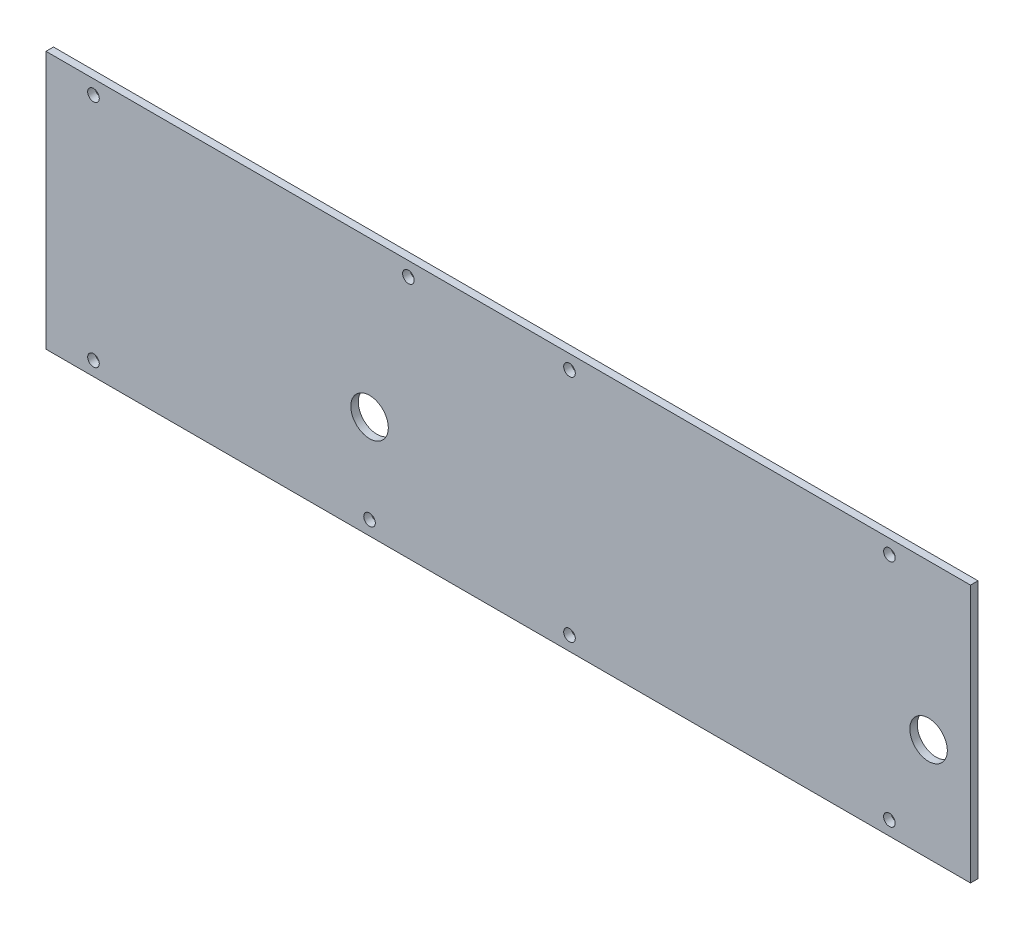
ISO-10303-21;
HEADER;
FILE_DESCRIPTION(('STEP AP214'),'2;1');
FILE_NAME('part.step','',(''),(''),'','','');
FILE_SCHEMA(('AUTOMOTIVE_DESIGN { 1 0 10303 214 1 1 1 1 }'));
ENDSEC;
DATA;
#1=APPLICATION_CONTEXT('core data for automotive mechanical design processes');
#2=APPLICATION_PROTOCOL_DEFINITION('international standard','automotive_design',2000,#1);
#3=PRODUCT_CONTEXT('',#1,'mechanical');
#4=PRODUCT('Part','Part','',(#3));
#5=PRODUCT_RELATED_PRODUCT_CATEGORY('part','',(#4));
#6=PRODUCT_DEFINITION_FORMATION('','',#4);
#7=PRODUCT_DEFINITION_CONTEXT('part definition',#1,'design');
#8=PRODUCT_DEFINITION('design','',#6,#7);
#9=PRODUCT_DEFINITION_SHAPE('','',#8);
#10=(LENGTH_UNIT() NAMED_UNIT(*) SI_UNIT(.MILLI.,.METRE.));
#11=(NAMED_UNIT(*) PLANE_ANGLE_UNIT() SI_UNIT($,.RADIAN.));
#12=(NAMED_UNIT(*) SI_UNIT($,.STERADIAN.) SOLID_ANGLE_UNIT());
#13=UNCERTAINTY_MEASURE_WITH_UNIT(LENGTH_MEASURE(1.E-05),#10,'distance_accuracy_value','');
#14=(GEOMETRIC_REPRESENTATION_CONTEXT(3) GLOBAL_UNCERTAINTY_ASSIGNED_CONTEXT((#13)) GLOBAL_UNIT_ASSIGNED_CONTEXT((#10,
#11,#12)) REPRESENTATION_CONTEXT('',''));
#15=CARTESIAN_POINT('',(0.,0.,0.));
#16=DIRECTION('',(0.,0.,1.));
#17=DIRECTION('',(1.,0.,0.));
#18=AXIS2_PLACEMENT_3D('',#15,#16,#17);
#19=CARTESIAN_POINT('',(0.,0.,-1.1049));
#20=DIRECTION('',(0.,0.,1.));
#21=DIRECTION('',(1.,0.,0.));
#22=AXIS2_PLACEMENT_3D('',#19,#20,#21);
#23=PLANE('',#22);
#24=CARTESIAN_POINT('',(112.5728,-33.9217,-1.1049));
#25=DIRECTION('',(0.,0.,-1.));
#26=DIRECTION('',(-1.,0.,0.));
#27=AXIS2_PLACEMENT_3D('',#24,#25,#26);
#28=CIRCLE('',#27,1.71449999999998);
#29=CARTESIAN_POINT('',(110.8583,-33.9217,-1.1049));
#30=VERTEX_POINT('',#29);
#31=EDGE_CURVE('E109',#30,#30,#28,.F.);
#32=ORIENTED_EDGE('',*,*,#31,.T.);
#33=EDGE_LOOP('',(#32));
#34=FACE_BOUND('',#33,.T.);
#35=CARTESIAN_POINT('',(-40.9702,-33.9217,-1.1049));
#36=DIRECTION('',(0.,0.,-1.));
#37=DIRECTION('',(-1.,0.,0.));
#38=AXIS2_PLACEMENT_3D('',#35,#36,#37);
#39=CIRCLE('',#38,1.71450000000002);
#40=CARTESIAN_POINT('',(-42.6847,-33.9217,-1.1049));
#41=VERTEX_POINT('',#40);
#42=EDGE_CURVE('E113',#41,#41,#39,.F.);
#43=ORIENTED_EDGE('',*,*,#42,.T.);
#44=EDGE_LOOP('',(#43));
#45=FACE_BOUND('',#44,.T.);
#46=CARTESIAN_POINT('',(18.0848,33.9217,-1.1049));
#47=DIRECTION('',(0.,0.,-1.));
#48=DIRECTION('',(-1.,0.,0.));
#49=AXIS2_PLACEMENT_3D('',#46,#47,#48);
#50=CIRCLE('',#49,1.71450000000001);
#51=CARTESIAN_POINT('',(16.3703,33.9217,-1.1049));
#52=VERTEX_POINT('',#51);
#53=EDGE_CURVE('E116',#52,#52,#50,.F.);
#54=ORIENTED_EDGE('',*,*,#53,.T.);
#55=EDGE_LOOP('',(#54));
#56=FACE_BOUND('',#55,.T.);
#57=CARTESIAN_POINT('',(-122.5042,-33.9217,-1.1049));
#58=DIRECTION('',(0.,0.,-1.));
#59=DIRECTION('',(-1.,0.,0.));
#60=AXIS2_PLACEMENT_3D('',#57,#58,#59);
#61=CIRCLE('',#60,1.7145);
#62=CARTESIAN_POINT('',(-124.2187,-33.9217,-1.1049));
#63=VERTEX_POINT('',#62);
#64=EDGE_CURVE('E119',#63,#63,#61,.F.);
#65=ORIENTED_EDGE('',*,*,#64,.T.);
#66=EDGE_LOOP('',(#65));
#67=FACE_BOUND('',#66,.T.);
#68=CARTESIAN_POINT('',(-122.5042,33.9217,-1.1049));
#69=DIRECTION('',(0.,0.,-1.));
#70=DIRECTION('',(-1.,0.,0.));
#71=AXIS2_PLACEMENT_3D('',#68,#69,#70);
#72=CIRCLE('',#71,1.71449999999998);
#73=CARTESIAN_POINT('',(-124.2187,33.9217,-1.1049));
#74=VERTEX_POINT('',#73);
#75=EDGE_CURVE('E122',#74,#74,#72,.F.);
#76=ORIENTED_EDGE('',*,*,#75,.T.);
#77=EDGE_LOOP('',(#76));
#78=FACE_BOUND('',#77,.T.);
#79=CARTESIAN_POINT('',(-29.4894,33.9217,-1.1049));
#80=DIRECTION('',(0.,0.,-1.));
#81=DIRECTION('',(-1.,0.,0.));
#82=AXIS2_PLACEMENT_3D('',#79,#80,#81);
#83=CIRCLE('',#82,1.71449999999999);
#84=CARTESIAN_POINT('',(-31.2039,33.9217,-1.1049));
#85=VERTEX_POINT('',#84);
#86=EDGE_CURVE('E125',#85,#85,#83,.F.);
#87=ORIENTED_EDGE('',*,*,#86,.T.);
#88=EDGE_LOOP('',(#87));
#89=FACE_BOUND('',#88,.T.);
#90=CARTESIAN_POINT('',(112.5728,33.9217,-1.1049));
#91=DIRECTION('',(0.,0.,-1.));
#92=DIRECTION('',(-1.,0.,0.));
#93=AXIS2_PLACEMENT_3D('',#90,#91,#92);
#94=CIRCLE('',#93,1.71449999999997);
#95=CARTESIAN_POINT('',(110.8583,33.9217,-1.1049));
#96=VERTEX_POINT('',#95);
#97=EDGE_CURVE('E128',#96,#96,#94,.F.);
#98=ORIENTED_EDGE('',*,*,#97,.T.);
#99=EDGE_LOOP('',(#98));
#100=FACE_BOUND('',#99,.T.);
#101=CARTESIAN_POINT('',(18.0848,-33.9217,-1.1049));
#102=DIRECTION('',(0.,0.,-1.));
#103=DIRECTION('',(-1.,0.,0.));
#104=AXIS2_PLACEMENT_3D('',#101,#102,#103);
#105=CIRCLE('',#104,1.71450000000003);
#106=CARTESIAN_POINT('',(16.3703,-33.9217,-1.1049));
#107=VERTEX_POINT('',#106);
#108=EDGE_CURVE('E131',#107,#107,#105,.F.);
#109=ORIENTED_EDGE('',*,*,#108,.T.);
#110=EDGE_LOOP('',(#109));
#111=FACE_BOUND('',#110,.T.);
#112=CARTESIAN_POINT('',(124.1298,-7.6581,-1.1049));
#113=DIRECTION('',(0.,0.,-1.));
#114=DIRECTION('',(-1.,0.,0.));
#115=AXIS2_PLACEMENT_3D('',#112,#113,#114);
#116=CIRCLE('',#115,5.5372);
#117=CARTESIAN_POINT('',(118.5926,-7.6581,-1.1049));
#118=VERTEX_POINT('',#117);
#119=EDGE_CURVE('E133',#118,#118,#116,.F.);
#120=ORIENTED_EDGE('',*,*,#119,.T.);
#121=EDGE_LOOP('',(#120));
#122=FACE_BOUND('',#121,.T.);
#123=CARTESIAN_POINT('',(-40.9702,-7.65809999999999,-1.1049));
#124=DIRECTION('',(0.,0.,-1.));
#125=DIRECTION('',(-1.,0.,0.));
#126=AXIS2_PLACEMENT_3D('',#123,#124,#125);
#127=CIRCLE('',#126,5.5372);
#128=CARTESIAN_POINT('',(-46.5074,-7.65809999999999,-1.1049));
#129=VERTEX_POINT('',#128);
#130=EDGE_CURVE('E21',#129,#129,#127,.F.);
#131=ORIENTED_EDGE('',*,*,#130,.T.);
#132=EDGE_LOOP('',(#131));
#133=FACE_BOUND('',#132,.T.);
#134=DIRECTION('',(1.,0.,0.));
#135=VECTOR('',#134,1.);
#136=CARTESIAN_POINT('',(-136.525,38.1,-1.1049));
#137=LINE('',#136,#135);
#138=CARTESIAN_POINT('',(136.525,38.1,-1.1049));
#139=VERTEX_POINT('',#138);
#140=CARTESIAN_POINT('',(-136.525,38.1,-1.1049));
#141=VERTEX_POINT('',#140);
#142=EDGE_CURVE('E56',#139,#141,#137,.F.);
#143=ORIENTED_EDGE('',*,*,#142,.F.);
#144=DIRECTION('',(0.,1.,0.));
#145=VECTOR('',#144,1.);
#146=CARTESIAN_POINT('',(136.525,38.1,-1.1049));
#147=LINE('',#146,#145);
#148=CARTESIAN_POINT('',(136.525,-38.1,-1.1049));
#149=VERTEX_POINT('',#148);
#150=EDGE_CURVE('E61',#149,#139,#147,.T.);
#151=ORIENTED_EDGE('',*,*,#150,.F.);
#152=DIRECTION('',(1.,0.,0.));
#153=VECTOR('',#152,1.);
#154=CARTESIAN_POINT('',(136.525,-38.1,-1.1049));
#155=LINE('',#154,#153);
#156=CARTESIAN_POINT('',(-136.525,-38.1,-1.1049));
#157=VERTEX_POINT('',#156);
#158=EDGE_CURVE('E140',#157,#149,#155,.T.);
#159=ORIENTED_EDGE('',*,*,#158,.F.);
#160=DIRECTION('',(0.,1.,0.));
#161=VECTOR('',#160,1.);
#162=CARTESIAN_POINT('',(-136.525,-38.1,-1.1049));
#163=LINE('',#162,#161);
#164=EDGE_CURVE('E71',#141,#157,#163,.F.);
#165=ORIENTED_EDGE('',*,*,#164,.F.);
#166=EDGE_LOOP('',(#143,#151,#159,#165));
#167=FACE_BOUND('',#166,.T.);
#168=ADVANCED_FACE('F17',(#34,#45,#56,#67,#78,#89,#100,#111,#122,#133,#167),#23,.F.);
#169=CARTESIAN_POINT('',(136.525,38.1,0.));
#170=DIRECTION('',(1.,0.,0.));
#171=DIRECTION('',(0.,0.,-1.));
#172=AXIS2_PLACEMENT_3D('',#169,#170,#171);
#173=PLANE('',#172);
#174=ORIENTED_EDGE('',*,*,#150,.T.);
#175=DIRECTION('',(0.,0.,1.));
#176=VECTOR('',#175,1.);
#177=CARTESIAN_POINT('',(136.525,38.1,0.));
#178=LINE('',#177,#176);
#179=CARTESIAN_POINT('',(136.525,38.1,1.1049));
#180=VERTEX_POINT('',#179);
#181=EDGE_CURVE('E63',#180,#139,#178,.F.);
#182=ORIENTED_EDGE('',*,*,#181,.F.);
#183=DIRECTION('',(0.,1.,0.));
#184=VECTOR('',#183,1.);
#185=CARTESIAN_POINT('',(136.525,0.,1.1049));
#186=LINE('',#185,#184);
#187=CARTESIAN_POINT('',(136.525,-38.1,1.1049));
#188=VERTEX_POINT('',#187);
#189=EDGE_CURVE('E112',#188,#180,#186,.T.);
#190=ORIENTED_EDGE('',*,*,#189,.F.);
#191=DIRECTION('',(0.,0.,-1.));
#192=VECTOR('',#191,1.);
#193=CARTESIAN_POINT('',(136.525,-38.1,0.));
#194=LINE('',#193,#192);
#195=EDGE_CURVE('E66',#149,#188,#194,.F.);
#196=ORIENTED_EDGE('',*,*,#195,.F.);
#197=EDGE_LOOP('',(#174,#182,#190,#196));
#198=FACE_BOUND('',#197,.T.);
#199=ADVANCED_FACE('F62',(#198),#173,.T.);
#200=CARTESIAN_POINT('',(-136.525,38.1,0.));
#201=DIRECTION('',(0.,1.,0.));
#202=DIRECTION('',(0.,0.,1.));
#203=AXIS2_PLACEMENT_3D('',#200,#201,#202);
#204=PLANE('',#203);
#205=ORIENTED_EDGE('',*,*,#142,.T.);
#206=DIRECTION('',(0.,0.,1.));
#207=VECTOR('',#206,1.);
#208=CARTESIAN_POINT('',(-136.525,38.1,0.));
#209=LINE('',#208,#207);
#210=CARTESIAN_POINT('',(-136.525,38.1,1.1049));
#211=VERTEX_POINT('',#210);
#212=EDGE_CURVE('E73',#211,#141,#209,.F.);
#213=ORIENTED_EDGE('',*,*,#212,.F.);
#214=DIRECTION('',(1.,0.,0.));
#215=VECTOR('',#214,1.);
#216=CARTESIAN_POINT('',(0.,38.1,1.1049));
#217=LINE('',#216,#215);
#218=EDGE_CURVE('E77',#180,#211,#217,.F.);
#219=ORIENTED_EDGE('',*,*,#218,.F.);
#220=ORIENTED_EDGE('',*,*,#181,.T.);
#221=EDGE_LOOP('',(#205,#213,#219,#220));
#222=FACE_BOUND('',#221,.T.);
#223=ADVANCED_FACE('F75',(#222),#204,.T.);
#224=CARTESIAN_POINT('',(-136.525,-38.1,0.));
#225=DIRECTION('',(-1.,0.,0.));
#226=DIRECTION('',(0.,0.,1.));
#227=AXIS2_PLACEMENT_3D('',#224,#225,#226);
#228=PLANE('',#227);
#229=ORIENTED_EDGE('',*,*,#164,.T.);
#230=DIRECTION('',(0.,0.,-1.));
#231=VECTOR('',#230,1.);
#232=CARTESIAN_POINT('',(-136.525,-38.1,0.));
#233=LINE('',#232,#231);
#234=CARTESIAN_POINT('',(-136.525,-38.1,1.1049));
#235=VERTEX_POINT('',#234);
#236=EDGE_CURVE('E36',#235,#157,#233,.T.);
#237=ORIENTED_EDGE('',*,*,#236,.F.);
#238=DIRECTION('',(0.,1.,0.));
#239=VECTOR('',#238,1.);
#240=CARTESIAN_POINT('',(-136.525,0.,1.1049));
#241=LINE('',#240,#239);
#242=EDGE_CURVE('E151',#211,#235,#241,.F.);
#243=ORIENTED_EDGE('',*,*,#242,.F.);
#244=ORIENTED_EDGE('',*,*,#212,.T.);
#245=EDGE_LOOP('',(#229,#237,#243,#244));
#246=FACE_BOUND('',#245,.T.);
#247=ADVANCED_FACE('F149',(#246),#228,.T.);
#248=CARTESIAN_POINT('',(136.525,-38.1,0.));
#249=DIRECTION('',(0.,-1.,0.));
#250=DIRECTION('',(0.,0.,-1.));
#251=AXIS2_PLACEMENT_3D('',#248,#249,#250);
#252=PLANE('',#251);
#253=ORIENTED_EDGE('',*,*,#158,.T.);
#254=ORIENTED_EDGE('',*,*,#195,.T.);
#255=DIRECTION('',(1.,0.,0.));
#256=VECTOR('',#255,1.);
#257=CARTESIAN_POINT('',(0.,-38.1,1.1049));
#258=LINE('',#257,#256);
#259=EDGE_CURVE('E108',#235,#188,#258,.T.);
#260=ORIENTED_EDGE('',*,*,#259,.F.);
#261=ORIENTED_EDGE('',*,*,#236,.T.);
#262=EDGE_LOOP('',(#253,#254,#260,#261));
#263=FACE_BOUND('',#262,.T.);
#264=ADVANCED_FACE('F156',(#263),#252,.T.);
#265=CARTESIAN_POINT('',(-40.9702,-7.65809999999999,1.1049));
#266=DIRECTION('',(0.,0.,-1.));
#267=DIRECTION('',(-1.,0.,0.));
#268=AXIS2_PLACEMENT_3D('',#265,#266,#267);
#269=CYLINDRICAL_SURFACE('',#268,5.5372);
#270=CARTESIAN_POINT('',(-40.9702,-7.65809999999999,1.1049));
#271=DIRECTION('',(0.,0.,-1.));
#272=DIRECTION('',(-1.,0.,0.));
#273=AXIS2_PLACEMENT_3D('',#270,#271,#272);
#274=CIRCLE('',#273,5.5372);
#275=CARTESIAN_POINT('',(-46.5074,-7.65809999999999,1.1049));
#276=VERTEX_POINT('',#275);
#277=EDGE_CURVE('E105',#276,#276,#274,.T.);
#278=ORIENTED_EDGE('',*,*,#277,.F.);
#279=EDGE_LOOP('',(#278));
#280=FACE_BOUND('',#279,.T.);
#281=ORIENTED_EDGE('',*,*,#130,.F.);
#282=EDGE_LOOP('',(#281));
#283=FACE_BOUND('',#282,.T.);
#284=ADVANCED_FACE('F158',(#280,#283),#269,.F.);
#285=CARTESIAN_POINT('',(124.1298,-7.6581,1.1049));
#286=DIRECTION('',(0.,0.,-1.));
#287=DIRECTION('',(-1.,0.,0.));
#288=AXIS2_PLACEMENT_3D('',#285,#286,#287);
#289=CYLINDRICAL_SURFACE('',#288,5.5372);
#290=CARTESIAN_POINT('',(124.1298,-7.6581,1.1049));
#291=DIRECTION('',(0.,0.,-1.));
#292=DIRECTION('',(-1.,0.,0.));
#293=AXIS2_PLACEMENT_3D('',#290,#291,#292);
#294=CIRCLE('',#293,5.5372);
#295=CARTESIAN_POINT('',(118.5926,-7.6581,1.1049));
#296=VERTEX_POINT('',#295);
#297=EDGE_CURVE('E102',#296,#296,#294,.T.);
#298=ORIENTED_EDGE('',*,*,#297,.F.);
#299=EDGE_LOOP('',(#298));
#300=FACE_BOUND('',#299,.T.);
#301=ORIENTED_EDGE('',*,*,#119,.F.);
#302=EDGE_LOOP('',(#301));
#303=FACE_BOUND('',#302,.T.);
#304=ADVANCED_FACE('F165',(#300,#303),#289,.F.);
#305=CARTESIAN_POINT('',(18.0848,-33.9217,1.1049));
#306=DIRECTION('',(0.,0.,-1.));
#307=DIRECTION('',(-1.,0.,0.));
#308=AXIS2_PLACEMENT_3D('',#305,#306,#307);
#309=CYLINDRICAL_SURFACE('',#308,1.71450000000003);
#310=CARTESIAN_POINT('',(18.0848,-33.9217,1.1049));
#311=DIRECTION('',(0.,0.,-1.));
#312=DIRECTION('',(-1.,0.,0.));
#313=AXIS2_PLACEMENT_3D('',#310,#311,#312);
#314=CIRCLE('',#313,1.71450000000003);
#315=CARTESIAN_POINT('',(16.3703,-33.9217,1.1049));
#316=VERTEX_POINT('',#315);
#317=EDGE_CURVE('E99',#316,#316,#314,.T.);
#318=ORIENTED_EDGE('',*,*,#317,.F.);
#319=EDGE_LOOP('',(#318));
#320=FACE_BOUND('',#319,.T.);
#321=ORIENTED_EDGE('',*,*,#108,.F.);
#322=EDGE_LOOP('',(#321));
#323=FACE_BOUND('',#322,.T.);
#324=ADVANCED_FACE('F200',(#320,#323),#309,.F.);
#325=CARTESIAN_POINT('',(112.5728,33.9217,1.1049));
#326=DIRECTION('',(0.,0.,-1.));
#327=DIRECTION('',(-1.,0.,0.));
#328=AXIS2_PLACEMENT_3D('',#325,#326,#327);
#329=CYLINDRICAL_SURFACE('',#328,1.71449999999997);
#330=CARTESIAN_POINT('',(112.5728,33.9217,1.1049));
#331=DIRECTION('',(0.,0.,-1.));
#332=DIRECTION('',(-1.,0.,0.));
#333=AXIS2_PLACEMENT_3D('',#330,#331,#332);
#334=CIRCLE('',#333,1.71449999999997);
#335=CARTESIAN_POINT('',(110.8583,33.9217,1.1049));
#336=VERTEX_POINT('',#335);
#337=EDGE_CURVE('E96',#336,#336,#334,.T.);
#338=ORIENTED_EDGE('',*,*,#337,.F.);
#339=EDGE_LOOP('',(#338));
#340=FACE_BOUND('',#339,.T.);
#341=ORIENTED_EDGE('',*,*,#97,.F.);
#342=EDGE_LOOP('',(#341));
#343=FACE_BOUND('',#342,.T.);
#344=ADVANCED_FACE('F205',(#340,#343),#329,.F.);
#345=CARTESIAN_POINT('',(-29.4894,33.9217,1.1049));
#346=DIRECTION('',(0.,0.,-1.));
#347=DIRECTION('',(-1.,0.,0.));
#348=AXIS2_PLACEMENT_3D('',#345,#346,#347);
#349=CYLINDRICAL_SURFACE('',#348,1.71449999999999);
#350=CARTESIAN_POINT('',(-29.4894,33.9217,1.1049));
#351=DIRECTION('',(0.,0.,-1.));
#352=DIRECTION('',(-1.,0.,0.));
#353=AXIS2_PLACEMENT_3D('',#350,#351,#352);
#354=CIRCLE('',#353,1.71449999999999);
#355=CARTESIAN_POINT('',(-31.2039,33.9217,1.1049));
#356=VERTEX_POINT('',#355);
#357=EDGE_CURVE('E93',#356,#356,#354,.T.);
#358=ORIENTED_EDGE('',*,*,#357,.F.);
#359=EDGE_LOOP('',(#358));
#360=FACE_BOUND('',#359,.T.);
#361=ORIENTED_EDGE('',*,*,#86,.F.);
#362=EDGE_LOOP('',(#361));
#363=FACE_BOUND('',#362,.T.);
#364=ADVANCED_FACE('F212',(#360,#363),#349,.F.);
#365=CARTESIAN_POINT('',(-122.5042,33.9217,1.1049));
#366=DIRECTION('',(0.,0.,-1.));
#367=DIRECTION('',(-1.,0.,0.));
#368=AXIS2_PLACEMENT_3D('',#365,#366,#367);
#369=CYLINDRICAL_SURFACE('',#368,1.71449999999998);
#370=CARTESIAN_POINT('',(-122.5042,33.9217,1.1049));
#371=DIRECTION('',(0.,0.,-1.));
#372=DIRECTION('',(-1.,0.,0.));
#373=AXIS2_PLACEMENT_3D('',#370,#371,#372);
#374=CIRCLE('',#373,1.71449999999998);
#375=CARTESIAN_POINT('',(-124.2187,33.9217,1.1049));
#376=VERTEX_POINT('',#375);
#377=EDGE_CURVE('E90',#376,#376,#374,.T.);
#378=ORIENTED_EDGE('',*,*,#377,.F.);
#379=EDGE_LOOP('',(#378));
#380=FACE_BOUND('',#379,.T.);
#381=ORIENTED_EDGE('',*,*,#75,.F.);
#382=EDGE_LOOP('',(#381));
#383=FACE_BOUND('',#382,.T.);
#384=ADVANCED_FACE('F216',(#380,#383),#369,.F.);
#385=CARTESIAN_POINT('',(-122.5042,-33.9217,1.1049));
#386=DIRECTION('',(0.,0.,-1.));
#387=DIRECTION('',(-1.,0.,0.));
#388=AXIS2_PLACEMENT_3D('',#385,#386,#387);
#389=CYLINDRICAL_SURFACE('',#388,1.7145);
#390=CARTESIAN_POINT('',(-122.5042,-33.9217,1.1049));
#391=DIRECTION('',(0.,0.,-1.));
#392=DIRECTION('',(-1.,0.,0.));
#393=AXIS2_PLACEMENT_3D('',#390,#391,#392);
#394=CIRCLE('',#393,1.7145);
#395=CARTESIAN_POINT('',(-124.2187,-33.9217,1.1049));
#396=VERTEX_POINT('',#395);
#397=EDGE_CURVE('E87',#396,#396,#394,.T.);
#398=ORIENTED_EDGE('',*,*,#397,.F.);
#399=EDGE_LOOP('',(#398));
#400=FACE_BOUND('',#399,.T.);
#401=ORIENTED_EDGE('',*,*,#64,.F.);
#402=EDGE_LOOP('',(#401));
#403=FACE_BOUND('',#402,.T.);
#404=ADVANCED_FACE('F220',(#400,#403),#389,.F.);
#405=CARTESIAN_POINT('',(18.0848,33.9217,1.1049));
#406=DIRECTION('',(0.,0.,-1.));
#407=DIRECTION('',(-1.,0.,0.));
#408=AXIS2_PLACEMENT_3D('',#405,#406,#407);
#409=CYLINDRICAL_SURFACE('',#408,1.71450000000001);
#410=CARTESIAN_POINT('',(18.0848,33.9217,1.1049));
#411=DIRECTION('',(0.,0.,-1.));
#412=DIRECTION('',(-1.,0.,0.));
#413=AXIS2_PLACEMENT_3D('',#410,#411,#412);
#414=CIRCLE('',#413,1.71450000000001);
#415=CARTESIAN_POINT('',(16.3703,33.9217,1.1049));
#416=VERTEX_POINT('',#415);
#417=EDGE_CURVE('E84',#416,#416,#414,.T.);
#418=ORIENTED_EDGE('',*,*,#417,.F.);
#419=EDGE_LOOP('',(#418));
#420=FACE_BOUND('',#419,.T.);
#421=ORIENTED_EDGE('',*,*,#53,.F.);
#422=EDGE_LOOP('',(#421));
#423=FACE_BOUND('',#422,.T.);
#424=ADVANCED_FACE('F224',(#420,#423),#409,.F.);
#425=CARTESIAN_POINT('',(-40.9702,-33.9217,1.1049));
#426=DIRECTION('',(0.,0.,-1.));
#427=DIRECTION('',(-1.,0.,0.));
#428=AXIS2_PLACEMENT_3D('',#425,#426,#427);
#429=CYLINDRICAL_SURFACE('',#428,1.71450000000002);
#430=CARTESIAN_POINT('',(-40.9702,-33.9217,1.1049));
#431=DIRECTION('',(0.,0.,-1.));
#432=DIRECTION('',(-1.,0.,0.));
#433=AXIS2_PLACEMENT_3D('',#430,#431,#432);
#434=CIRCLE('',#433,1.71450000000002);
#435=CARTESIAN_POINT('',(-42.6847,-33.9217,1.1049));
#436=VERTEX_POINT('',#435);
#437=EDGE_CURVE('E27',#436,#436,#434,.T.);
#438=ORIENTED_EDGE('',*,*,#437,.F.);
#439=EDGE_LOOP('',(#438));
#440=FACE_BOUND('',#439,.T.);
#441=ORIENTED_EDGE('',*,*,#42,.F.);
#442=EDGE_LOOP('',(#441));
#443=FACE_BOUND('',#442,.T.);
#444=ADVANCED_FACE('F175',(#440,#443),#429,.F.);
#445=CARTESIAN_POINT('',(112.5728,-33.9217,1.1049));
#446=DIRECTION('',(0.,0.,-1.));
#447=DIRECTION('',(-1.,0.,0.));
#448=AXIS2_PLACEMENT_3D('',#445,#446,#447);
#449=CYLINDRICAL_SURFACE('',#448,1.71449999999998);
#450=CARTESIAN_POINT('',(112.5728,-33.9217,1.1049));
#451=DIRECTION('',(0.,0.,-1.));
#452=DIRECTION('',(-1.,0.,0.));
#453=AXIS2_PLACEMENT_3D('',#450,#451,#452);
#454=CIRCLE('',#453,1.71449999999998);
#455=CARTESIAN_POINT('',(110.8583,-33.9217,1.1049));
#456=VERTEX_POINT('',#455);
#457=EDGE_CURVE('E11',#456,#456,#454,.T.);
#458=ORIENTED_EDGE('',*,*,#457,.F.);
#459=EDGE_LOOP('',(#458));
#460=FACE_BOUND('',#459,.T.);
#461=ORIENTED_EDGE('',*,*,#31,.F.);
#462=EDGE_LOOP('',(#461));
#463=FACE_BOUND('',#462,.T.);
#464=ADVANCED_FACE('F19',(#460,#463),#449,.F.);
#465=CARTESIAN_POINT('',(0.,0.,1.1049));
#466=DIRECTION('',(0.,0.,1.));
#467=DIRECTION('',(1.,0.,0.));
#468=AXIS2_PLACEMENT_3D('',#465,#466,#467);
#469=PLANE('',#468);
#470=ORIENTED_EDGE('',*,*,#457,.T.);
#471=EDGE_LOOP('',(#470));
#472=FACE_BOUND('',#471,.T.);
#473=ORIENTED_EDGE('',*,*,#437,.T.);
#474=EDGE_LOOP('',(#473));
#475=FACE_BOUND('',#474,.T.);
#476=ORIENTED_EDGE('',*,*,#417,.T.);
#477=EDGE_LOOP('',(#476));
#478=FACE_BOUND('',#477,.T.);
#479=ORIENTED_EDGE('',*,*,#397,.T.);
#480=EDGE_LOOP('',(#479));
#481=FACE_BOUND('',#480,.T.);
#482=ORIENTED_EDGE('',*,*,#377,.T.);
#483=EDGE_LOOP('',(#482));
#484=FACE_BOUND('',#483,.T.);
#485=ORIENTED_EDGE('',*,*,#357,.T.);
#486=EDGE_LOOP('',(#485));
#487=FACE_BOUND('',#486,.T.);
#488=ORIENTED_EDGE('',*,*,#337,.T.);
#489=EDGE_LOOP('',(#488));
#490=FACE_BOUND('',#489,.T.);
#491=ORIENTED_EDGE('',*,*,#317,.T.);
#492=EDGE_LOOP('',(#491));
#493=FACE_BOUND('',#492,.T.);
#494=ORIENTED_EDGE('',*,*,#297,.T.);
#495=EDGE_LOOP('',(#494));
#496=FACE_BOUND('',#495,.T.);
#497=ORIENTED_EDGE('',*,*,#277,.T.);
#498=EDGE_LOOP('',(#497));
#499=FACE_BOUND('',#498,.T.);
#500=ORIENTED_EDGE('',*,*,#242,.T.);
#501=ORIENTED_EDGE('',*,*,#259,.T.);
#502=ORIENTED_EDGE('',*,*,#189,.T.);
#503=ORIENTED_EDGE('',*,*,#218,.T.);
#504=EDGE_LOOP('',(#500,#501,#502,#503));
#505=FACE_BOUND('',#504,.T.);
#506=ADVANCED_FACE('F154',(#472,#475,#478,#481,#484,#487,#490,#493,#496,#499,#505),#469,.T.);
#507=CLOSED_SHELL('',(#168,#199,#223,#247,#264,#284,#304,#324,#344,#364,#384,#404,#424,#444,
#464,#506));
#508=MANIFOLD_SOLID_BREP('B1',#507);
#509=ADVANCED_BREP_SHAPE_REPRESENTATION('',(#18,#508),#14);
#510=SHAPE_DEFINITION_REPRESENTATION(#9,#509);
ENDSEC;
END-ISO-10303-21;
